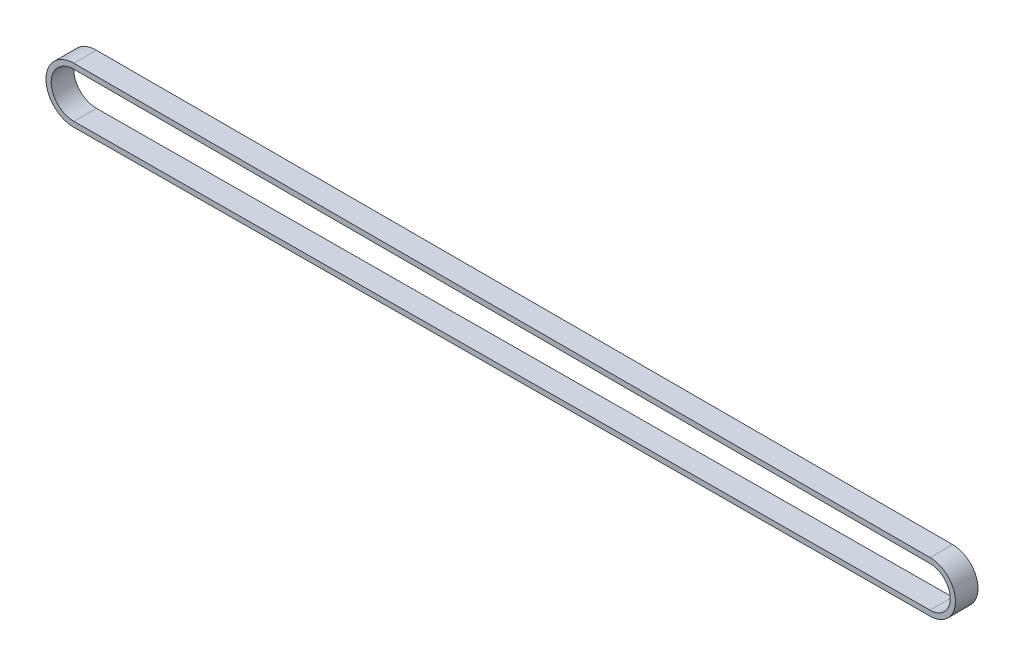
ISO-10303-21;
HEADER;
FILE_DESCRIPTION(('STEP AP214'),'2;1');
FILE_NAME('part.step','',(''),(''),'','','');
FILE_SCHEMA(('AUTOMOTIVE_DESIGN { 1 0 10303 214 1 1 1 1 }'));
ENDSEC;
DATA;
#1=APPLICATION_CONTEXT('core data for automotive mechanical design processes');
#2=APPLICATION_PROTOCOL_DEFINITION('international standard','automotive_design',2000,#1);
#3=PRODUCT_CONTEXT('',#1,'mechanical');
#4=PRODUCT('Part','Part','',(#3));
#5=PRODUCT_RELATED_PRODUCT_CATEGORY('part','',(#4));
#6=PRODUCT_DEFINITION_FORMATION('','',#4);
#7=PRODUCT_DEFINITION_CONTEXT('part definition',#1,'design');
#8=PRODUCT_DEFINITION('design','',#6,#7);
#9=PRODUCT_DEFINITION_SHAPE('','',#8);
#10=(LENGTH_UNIT() NAMED_UNIT(*) SI_UNIT(.MILLI.,.METRE.));
#11=(NAMED_UNIT(*) PLANE_ANGLE_UNIT() SI_UNIT($,.RADIAN.));
#12=(NAMED_UNIT(*) SI_UNIT($,.STERADIAN.) SOLID_ANGLE_UNIT());
#13=UNCERTAINTY_MEASURE_WITH_UNIT(LENGTH_MEASURE(1.E-05),#10,'distance_accuracy_value','');
#14=(GEOMETRIC_REPRESENTATION_CONTEXT(3) GLOBAL_UNCERTAINTY_ASSIGNED_CONTEXT((#13)) GLOBAL_UNIT_ASSIGNED_CONTEXT((#10,
#11,#12)) REPRESENTATION_CONTEXT('',''));
#15=CARTESIAN_POINT('',(0.,0.,0.));
#16=DIRECTION('',(0.,0.,1.));
#17=DIRECTION('',(1.,0.,0.));
#18=AXIS2_PLACEMENT_3D('',#15,#16,#17);
#19=CARTESIAN_POINT('',(0.,-10.80125,-14.9625000000001));
#20=DIRECTION('',(0.,1.,0.));
#21=DIRECTION('',(-1.,0.,0.));
#22=AXIS2_PLACEMENT_3D('',#19,#20,#21);
#23=PLANE('',#22);
#24=DIRECTION('',(-1.,0.,0.));
#25=VECTOR('',#24,1.);
#26=CARTESIAN_POINT('',(0.,-10.80125,-8.96250000000007));
#27=LINE('',#26,#25);
#28=CARTESIAN_POINT('',(12.,-10.80125,-8.96250000000007));
#29=VERTEX_POINT('',#28);
#30=CARTESIAN_POINT('',(-215.780874971429,-10.80125,-8.96250000000007));
#31=VERTEX_POINT('',#30);
#32=EDGE_CURVE('E141',#29,#31,#27,.T.);
#33=ORIENTED_EDGE('',*,*,#32,.F.);
#34=DIRECTION('',(0.,0.,1.));
#35=VECTOR('',#34,1.);
#36=CARTESIAN_POINT('',(12.,-10.80125,-14.9625000000001));
#37=LINE('',#36,#35);
#38=CARTESIAN_POINT('',(12.,-10.80125,-14.9625000000001));
#39=VERTEX_POINT('',#38);
#40=EDGE_CURVE('E11',#39,#29,#37,.T.);
#41=ORIENTED_EDGE('',*,*,#40,.F.);
#42=DIRECTION('',(-1.,0.,0.));
#43=VECTOR('',#42,1.);
#44=CARTESIAN_POINT('',(0.,-10.80125,-14.9625000000001));
#45=LINE('',#44,#43);
#46=CARTESIAN_POINT('',(-215.780874971429,-10.80125,-14.9625000000001));
#47=VERTEX_POINT('',#46);
#48=EDGE_CURVE('E125',#39,#47,#45,.T.);
#49=ORIENTED_EDGE('',*,*,#48,.T.);
#50=DIRECTION('',(0.,0.,1.));
#51=VECTOR('',#50,1.);
#52=CARTESIAN_POINT('',(-215.780874971429,-10.80125,-14.9625000000001));
#53=LINE('',#52,#51);
#54=EDGE_CURVE('E122',#47,#31,#53,.T.);
#55=ORIENTED_EDGE('',*,*,#54,.T.);
#56=EDGE_LOOP('',(#33,#41,#49,#55));
#57=FACE_BOUND('',#56,.T.);
#58=ADVANCED_FACE('F35',(#57),#23,.T.);
#59=CARTESIAN_POINT('',(12.,-17.5474531009775,-14.9625000000001));
#60=DIRECTION('',(0.,0.,1.));
#61=DIRECTION('',(1.,0.,0.));
#62=AXIS2_PLACEMENT_3D('',#59,#60,#61);
#63=CYLINDRICAL_SURFACE('',#62,6.74620310097754);
#64=CARTESIAN_POINT('',(12.,-17.5474531009775,-8.96250000000007));
#65=DIRECTION('',(0.,0.,1.));
#66=DIRECTION('',(1.,0.,0.));
#67=AXIS2_PLACEMENT_3D('',#64,#65,#66);
#68=CIRCLE('',#67,6.74620310097754);
#69=CARTESIAN_POINT('',(12.0375421290551,-24.293551741539,-8.96250000000007));
#70=VERTEX_POINT('',#69);
#71=EDGE_CURVE('E147',#70,#29,#68,.T.);
#72=ORIENTED_EDGE('',*,*,#71,.F.);
#73=DIRECTION('',(0.,0.,1.));
#74=VECTOR('',#73,1.);
#75=CARTESIAN_POINT('',(12.0375421290551,-24.293551741539,-14.9625000000001));
#76=LINE('',#75,#74);
#77=CARTESIAN_POINT('',(12.0375421290551,-24.293551741539,-14.9625000000001));
#78=VERTEX_POINT('',#77);
#79=EDGE_CURVE('E45',#78,#70,#76,.T.);
#80=ORIENTED_EDGE('',*,*,#79,.F.);
#81=CARTESIAN_POINT('',(12.,-17.5474531009775,-14.9625000000001));
#82=DIRECTION('',(0.,0.,1.));
#83=DIRECTION('',(1.,0.,0.));
#84=AXIS2_PLACEMENT_3D('',#81,#82,#83);
#85=CIRCLE('',#84,6.74620310097754);
#86=EDGE_CURVE('E114',#78,#39,#85,.T.);
#87=ORIENTED_EDGE('',*,*,#86,.T.);
#88=ORIENTED_EDGE('',*,*,#40,.T.);
#89=EDGE_LOOP('',(#72,#80,#87,#88));
#90=FACE_BOUND('',#89,.T.);
#91=ADVANCED_FACE('F191',(#90),#63,.T.);
#92=CARTESIAN_POINT('',(0.13556253683011,-24.3597864169669,-14.9625000000001));
#93=DIRECTION('',(-0.0055649271884016,0.999984515672812,0.));
#94=DIRECTION('',(-0.999984515672812,-0.0055649271884016,0.));
#95=AXIS2_PLACEMENT_3D('',#92,#93,#94);
#96=PLANE('',#95);
#97=DIRECTION('',(-0.999984515672812,-0.0055649271884016,0.));
#98=VECTOR('',#97,1.);
#99=CARTESIAN_POINT('',(0.13556253683011,-24.3597864169669,-8.96250000000007));
#100=LINE('',#99,#98);
#101=CARTESIAN_POINT('',(-215.739805808778,-25.5611357256654,-8.96250000000007));
#102=VERTEX_POINT('',#101);
#103=EDGE_CURVE('E118',#70,#102,#100,.T.);
#104=ORIENTED_EDGE('',*,*,#103,.T.);
#105=DIRECTION('',(0.,0.,1.));
#106=VECTOR('',#105,1.);
#107=CARTESIAN_POINT('',(-215.739805808778,-25.5611357256654,-14.9625000000001));
#108=LINE('',#107,#106);
#109=CARTESIAN_POINT('',(-215.739805808778,-25.5611357256654,-14.9625000000001));
#110=VERTEX_POINT('',#109);
#111=EDGE_CURVE('E116',#110,#102,#108,.T.);
#112=ORIENTED_EDGE('',*,*,#111,.F.);
#113=DIRECTION('',(-0.999984515672812,-0.0055649271884016,0.));
#114=VECTOR('',#113,1.);
#115=CARTESIAN_POINT('',(0.13556253683011,-24.3597864169669,-14.9625000000001));
#116=LINE('',#115,#114);
#117=EDGE_CURVE('E109',#78,#110,#116,.T.);
#118=ORIENTED_EDGE('',*,*,#117,.F.);
#119=ORIENTED_EDGE('',*,*,#79,.T.);
#120=EDGE_LOOP('',(#104,#112,#118,#119));
#121=FACE_BOUND('',#120,.T.);
#122=ADVANCED_FACE('F117',(#121),#96,.F.);
#123=CARTESIAN_POINT('',(-215.780874971429,-18.18125,-14.9625000000001));
#124=DIRECTION('',(0.,0.,1.));
#125=DIRECTION('',(1.,0.,0.));
#126=AXIS2_PLACEMENT_3D('',#123,#124,#125);
#127=CYLINDRICAL_SURFACE('',#126,5.99999999999999);
#128=CARTESIAN_POINT('',(-215.780874971429,-18.18125,-8.96250000000007));
#129=DIRECTION('',(0.,0.,1.));
#130=DIRECTION('',(1.,0.,0.));
#131=AXIS2_PLACEMENT_3D('',#128,#129,#130);
#132=CIRCLE('',#131,5.99999999999999);
#133=CARTESIAN_POINT('',(-215.780874971429,-12.18125,-8.96250000000007));
#134=VERTEX_POINT('',#133);
#135=CARTESIAN_POINT('',(-215.747483219309,-24.1811570818547,-8.96250000000007));
#136=VERTEX_POINT('',#135);
#137=EDGE_CURVE('E132',#134,#136,#132,.T.);
#138=ORIENTED_EDGE('',*,*,#137,.T.);
#139=DIRECTION('',(0.,0.,1.));
#140=VECTOR('',#139,1.);
#141=CARTESIAN_POINT('',(-215.747483219309,-24.1811570818547,-14.9625000000001));
#142=LINE('',#141,#140);
#143=CARTESIAN_POINT('',(-215.747483219309,-24.1811570818547,-14.9625000000001));
#144=VERTEX_POINT('',#143);
#145=EDGE_CURVE('E153',#144,#136,#142,.T.);
#146=ORIENTED_EDGE('',*,*,#145,.F.);
#147=CARTESIAN_POINT('',(-215.780874971429,-18.18125,-14.9625000000001));
#148=DIRECTION('',(0.,0.,1.));
#149=DIRECTION('',(1.,0.,0.));
#150=AXIS2_PLACEMENT_3D('',#147,#148,#149);
#151=CIRCLE('',#150,5.99999999999999);
#152=CARTESIAN_POINT('',(-215.780874971429,-12.18125,-14.9625000000001));
#153=VERTEX_POINT('',#152);
#154=EDGE_CURVE('E149',#153,#144,#151,.T.);
#155=ORIENTED_EDGE('',*,*,#154,.F.);
#156=DIRECTION('',(0.,0.,1.));
#157=VECTOR('',#156,1.);
#158=CARTESIAN_POINT('',(-215.780874971429,-12.18125,-14.9625000000001));
#159=LINE('',#158,#157);
#160=EDGE_CURVE('E39',#153,#134,#159,.T.);
#161=ORIENTED_EDGE('',*,*,#160,.T.);
#162=EDGE_LOOP('',(#138,#146,#155,#161));
#163=FACE_BOUND('',#162,.T.);
#164=ADVANCED_FACE('F37',(#163),#127,.F.);
#165=CARTESIAN_POINT('',(0.127890882873493,-22.9797289793114,-14.9625000000001));
#166=DIRECTION('',(0.00556529201996646,-0.999984513642453,0.));
#167=DIRECTION('',(0.999984513642453,0.00556529201996646,0.));
#168=AXIS2_PLACEMENT_3D('',#165,#166,#167);
#169=PLANE('',#168);
#170=DIRECTION('',(0.999984513642453,0.00556529201996646,0.));
#171=VECTOR('',#170,1.);
#172=CARTESIAN_POINT('',(0.127890882873493,-22.9797289793114,-8.96250000000007));
#173=LINE('',#172,#171);
#174=CARTESIAN_POINT('',(12.,-22.9136562019551,-8.96250000000007));
#175=VERTEX_POINT('',#174);
#176=EDGE_CURVE('E139',#136,#175,#173,.T.);
#177=ORIENTED_EDGE('',*,*,#176,.T.);
#178=DIRECTION('',(0.,0.,1.));
#179=VECTOR('',#178,1.);
#180=CARTESIAN_POINT('',(12.,-22.9136562019551,-14.9625000000001));
#181=LINE('',#180,#179);
#182=CARTESIAN_POINT('',(12.,-22.9136562019551,-14.9625000000001));
#183=VERTEX_POINT('',#182);
#184=EDGE_CURVE('E156',#183,#175,#181,.T.);
#185=ORIENTED_EDGE('',*,*,#184,.F.);
#186=DIRECTION('',(0.999984513642453,0.00556529201996646,0.));
#187=VECTOR('',#186,1.);
#188=CARTESIAN_POINT('',(0.127890882873493,-22.9797289793114,-14.9625000000001));
#189=LINE('',#188,#187);
#190=EDGE_CURVE('E127',#144,#183,#189,.T.);
#191=ORIENTED_EDGE('',*,*,#190,.F.);
#192=ORIENTED_EDGE('',*,*,#145,.T.);
#193=EDGE_LOOP('',(#177,#185,#191,#192));
#194=FACE_BOUND('',#193,.T.);
#195=ADVANCED_FACE('F174',(#194),#169,.F.);
#196=CARTESIAN_POINT('',(12.,-17.5474531009775,-14.9625000000001));
#197=DIRECTION('',(0.,0.,1.));
#198=DIRECTION('',(1.,0.,0.));
#199=AXIS2_PLACEMENT_3D('',#196,#197,#198);
#200=CYLINDRICAL_SURFACE('',#199,5.36620310097752);
#201=CARTESIAN_POINT('',(12.,-17.5474531009775,-8.96250000000007));
#202=DIRECTION('',(0.,0.,1.));
#203=DIRECTION('',(1.,0.,0.));
#204=AXIS2_PLACEMENT_3D('',#201,#202,#203);
#205=CIRCLE('',#204,5.36620310097752);
#206=CARTESIAN_POINT('',(12.,-12.18125,-8.96250000000007));
#207=VERTEX_POINT('',#206);
#208=EDGE_CURVE('E137',#175,#207,#205,.T.);
#209=ORIENTED_EDGE('',*,*,#208,.T.);
#210=DIRECTION('',(0.,0.,1.));
#211=VECTOR('',#210,1.);
#212=CARTESIAN_POINT('',(12.,-12.18125,-14.9625000000001));
#213=LINE('',#212,#211);
#214=CARTESIAN_POINT('',(12.,-12.18125,-14.9625000000001));
#215=VERTEX_POINT('',#214);
#216=EDGE_CURVE('E158',#215,#207,#213,.T.);
#217=ORIENTED_EDGE('',*,*,#216,.F.);
#218=CARTESIAN_POINT('',(12.,-17.5474531009775,-14.9625000000001));
#219=DIRECTION('',(0.,0.,1.));
#220=DIRECTION('',(1.,0.,0.));
#221=AXIS2_PLACEMENT_3D('',#218,#219,#220);
#222=CIRCLE('',#221,5.36620310097752);
#223=EDGE_CURVE('E176',#183,#215,#222,.T.);
#224=ORIENTED_EDGE('',*,*,#223,.F.);
#225=ORIENTED_EDGE('',*,*,#184,.T.);
#226=EDGE_LOOP('',(#209,#217,#224,#225));
#227=FACE_BOUND('',#226,.T.);
#228=ADVANCED_FACE('F181',(#227),#200,.F.);
#229=CARTESIAN_POINT('',(0.,-12.18125,-14.9625000000001));
#230=DIRECTION('',(0.,1.,0.));
#231=DIRECTION('',(-1.,0.,0.));
#232=AXIS2_PLACEMENT_3D('',#229,#230,#231);
#233=PLANE('',#232);
#234=DIRECTION('',(-1.,0.,0.));
#235=VECTOR('',#234,1.);
#236=CARTESIAN_POINT('',(0.,-12.18125,-8.96250000000007));
#237=LINE('',#236,#235);
#238=EDGE_CURVE('E135',#207,#134,#237,.T.);
#239=ORIENTED_EDGE('',*,*,#238,.T.);
#240=ORIENTED_EDGE('',*,*,#160,.F.);
#241=DIRECTION('',(-1.,0.,0.));
#242=VECTOR('',#241,1.);
#243=CARTESIAN_POINT('',(0.,-12.18125,-14.9625000000001));
#244=LINE('',#243,#242);
#245=EDGE_CURVE('E93',#215,#153,#244,.T.);
#246=ORIENTED_EDGE('',*,*,#245,.F.);
#247=ORIENTED_EDGE('',*,*,#216,.T.);
#248=EDGE_LOOP('',(#239,#240,#246,#247));
#249=FACE_BOUND('',#248,.T.);
#250=ADVANCED_FACE('F182',(#249),#233,.F.);
#251=CARTESIAN_POINT('',(-215.780874971429,-18.18125,-14.9625000000001));
#252=DIRECTION('',(0.,0.,1.));
#253=DIRECTION('',(1.,0.,0.));
#254=AXIS2_PLACEMENT_3D('',#251,#252,#253);
#255=CYLINDRICAL_SURFACE('',#254,7.38);
#256=CARTESIAN_POINT('',(-215.780874971429,-18.18125,-8.96250000000007));
#257=DIRECTION('',(0.,0.,1.));
#258=DIRECTION('',(1.,0.,0.));
#259=AXIS2_PLACEMENT_3D('',#256,#257,#258);
#260=CIRCLE('',#259,7.38);
#261=EDGE_CURVE('E144',#31,#102,#260,.T.);
#262=ORIENTED_EDGE('',*,*,#261,.F.);
#263=ORIENTED_EDGE('',*,*,#54,.F.);
#264=CARTESIAN_POINT('',(-215.780874971429,-18.18125,-14.9625000000001));
#265=DIRECTION('',(0.,0.,1.));
#266=DIRECTION('',(1.,0.,0.));
#267=AXIS2_PLACEMENT_3D('',#264,#265,#266);
#268=CIRCLE('',#267,7.38);
#269=EDGE_CURVE('E113',#47,#110,#268,.T.);
#270=ORIENTED_EDGE('',*,*,#269,.T.);
#271=ORIENTED_EDGE('',*,*,#111,.T.);
#272=EDGE_LOOP('',(#262,#263,#270,#271));
#273=FACE_BOUND('',#272,.T.);
#274=ADVANCED_FACE('F124',(#273),#255,.T.);
#275=CARTESIAN_POINT('',(0.,0.,-14.9625000000001));
#276=DIRECTION('',(0.,0.,1.));
#277=DIRECTION('',(1.,0.,0.));
#278=AXIS2_PLACEMENT_3D('',#275,#276,#277);
#279=PLANE('',#278);
#280=ORIENTED_EDGE('',*,*,#154,.T.);
#281=ORIENTED_EDGE('',*,*,#190,.T.);
#282=ORIENTED_EDGE('',*,*,#223,.T.);
#283=ORIENTED_EDGE('',*,*,#245,.T.);
#284=EDGE_LOOP('',(#280,#281,#282,#283));
#285=FACE_BOUND('',#284,.T.);
#286=ORIENTED_EDGE('',*,*,#48,.F.);
#287=ORIENTED_EDGE('',*,*,#86,.F.);
#288=ORIENTED_EDGE('',*,*,#117,.T.);
#289=ORIENTED_EDGE('',*,*,#269,.F.);
#290=EDGE_LOOP('',(#286,#287,#288,#289));
#291=FACE_BOUND('',#290,.T.);
#292=ADVANCED_FACE('F111',(#285,#291),#279,.F.);
#293=CARTESIAN_POINT('',(0.,0.,-8.96250000000007));
#294=DIRECTION('',(0.,0.,1.));
#295=DIRECTION('',(1.,0.,0.));
#296=AXIS2_PLACEMENT_3D('',#293,#294,#295);
#297=PLANE('',#296);
#298=ORIENTED_EDGE('',*,*,#137,.F.);
#299=ORIENTED_EDGE('',*,*,#238,.F.);
#300=ORIENTED_EDGE('',*,*,#208,.F.);
#301=ORIENTED_EDGE('',*,*,#176,.F.);
#302=EDGE_LOOP('',(#298,#299,#300,#301));
#303=FACE_BOUND('',#302,.T.);
#304=ORIENTED_EDGE('',*,*,#32,.T.);
#305=ORIENTED_EDGE('',*,*,#261,.T.);
#306=ORIENTED_EDGE('',*,*,#103,.F.);
#307=ORIENTED_EDGE('',*,*,#71,.T.);
#308=EDGE_LOOP('',(#304,#305,#306,#307));
#309=FACE_BOUND('',#308,.T.);
#310=ADVANCED_FACE('F169',(#303,#309),#297,.T.);
#311=CLOSED_SHELL('',(#58,#91,#122,#164,#195,#228,#250,#274,#292,#310));
#312=MANIFOLD_SOLID_BREP('B2',#311);
#313=ADVANCED_BREP_SHAPE_REPRESENTATION('',(#18,#312),#14);
#314=SHAPE_DEFINITION_REPRESENTATION(#9,#313);
ENDSEC;
END-ISO-10303-21;
